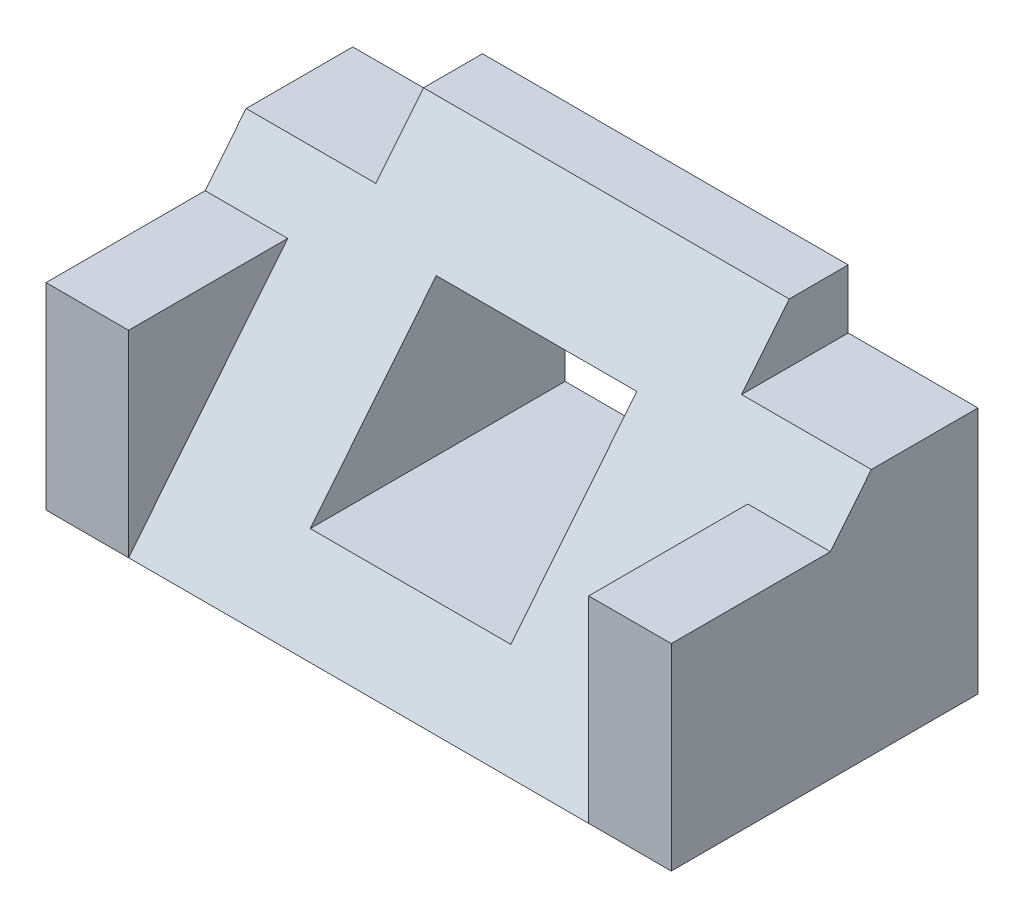
ISO-10303-21;
HEADER;
FILE_DESCRIPTION(('STEP AP214'),'2;1');
FILE_NAME('part.step','',(''),(''),'','','');
FILE_SCHEMA(('AUTOMOTIVE_DESIGN { 1 0 10303 214 1 1 1 1 }'));
ENDSEC;
DATA;
#1=APPLICATION_CONTEXT('core data for automotive mechanical design processes');
#2=APPLICATION_PROTOCOL_DEFINITION('international standard','automotive_design',2000,#1);
#3=PRODUCT_CONTEXT('',#1,'mechanical');
#4=PRODUCT('Part','Part','',(#3));
#5=PRODUCT_RELATED_PRODUCT_CATEGORY('part','',(#4));
#6=PRODUCT_DEFINITION_FORMATION('','',#4);
#7=PRODUCT_DEFINITION_CONTEXT('part definition',#1,'design');
#8=PRODUCT_DEFINITION('design','',#6,#7);
#9=PRODUCT_DEFINITION_SHAPE('','',#8);
#10=(LENGTH_UNIT() NAMED_UNIT(*) SI_UNIT(.MILLI.,.METRE.));
#11=(NAMED_UNIT(*) PLANE_ANGLE_UNIT() SI_UNIT($,.RADIAN.));
#12=(NAMED_UNIT(*) SI_UNIT($,.STERADIAN.) SOLID_ANGLE_UNIT());
#13=UNCERTAINTY_MEASURE_WITH_UNIT(LENGTH_MEASURE(1.E-05),#10,'distance_accuracy_value','');
#14=(GEOMETRIC_REPRESENTATION_CONTEXT(3) GLOBAL_UNCERTAINTY_ASSIGNED_CONTEXT((#13)) GLOBAL_UNIT_ASSIGNED_CONTEXT((#10,
#11,#12)) REPRESENTATION_CONTEXT('',''));
#15=CARTESIAN_POINT('',(0.,0.,0.));
#16=DIRECTION('',(0.,0.,1.));
#17=DIRECTION('',(1.,0.,0.));
#18=AXIS2_PLACEMENT_3D('',#15,#16,#17);
#19=CARTESIAN_POINT('',(26.5,-13.,-13.));
#20=DIRECTION('',(0.,0.,1.));
#21=DIRECTION('',(1.,0.,0.));
#22=AXIS2_PLACEMENT_3D('',#19,#20,#21);
#23=PLANE('',#22);
#24=DIRECTION('',(1.,0.,0.));
#25=VECTOR('',#24,1.);
#26=CARTESIAN_POINT('',(-8.5,-7.55441173857395,-13.));
#27=LINE('',#26,#25);
#28=CARTESIAN_POINT('',(-8.5,-7.55441173857395,-13.));
#29=VERTEX_POINT('',#28);
#30=CARTESIAN_POINT('',(8.5,-7.55441173857395,-13.));
#31=VERTEX_POINT('',#30);
#32=EDGE_CURVE('E170',#29,#31,#27,.T.);
#33=ORIENTED_EDGE('',*,*,#32,.T.);
#34=DIRECTION('',(0.,1.,0.));
#35=VECTOR('',#34,1.);
#36=CARTESIAN_POINT('',(8.5,-13.,-13.));
#37=LINE('',#36,#35);
#38=CARTESIAN_POINT('',(8.5,5.67058832488932,-13.));
#39=VERTEX_POINT('',#38);
#40=EDGE_CURVE('E182',#31,#39,#37,.T.);
#41=ORIENTED_EDGE('',*,*,#40,.T.);
#42=DIRECTION('',(-1.,0.,0.));
#43=VECTOR('',#42,1.);
#44=CARTESIAN_POINT('',(26.5,5.67058832488932,-13.));
#45=LINE('',#44,#43);
#46=CARTESIAN_POINT('',(-8.5,5.67058832488932,-13.));
#47=VERTEX_POINT('',#46);
#48=EDGE_CURVE('E180',#39,#47,#45,.T.);
#49=ORIENTED_EDGE('',*,*,#48,.T.);
#50=DIRECTION('',(0.,-1.,0.));
#51=VECTOR('',#50,1.);
#52=CARTESIAN_POINT('',(-8.5,-13.,-13.));
#53=LINE('',#52,#51);
#54=EDGE_CURVE('E161',#47,#29,#53,.T.);
#55=ORIENTED_EDGE('',*,*,#54,.T.);
#56=EDGE_LOOP('',(#33,#41,#49,#55));
#57=FACE_BOUND('',#56,.T.);
#58=DIRECTION('',(0.,-1.,0.));
#59=VECTOR('',#58,1.);
#60=CARTESIAN_POINT('',(-15.5,8.,-13.));
#61=LINE('',#60,#59);
#62=CARTESIAN_POINT('',(-15.5,13.,-13.));
#63=VERTEX_POINT('',#62);
#64=CARTESIAN_POINT('',(-15.5,8.,-13.));
#65=VERTEX_POINT('',#64);
#66=EDGE_CURVE('E222',#63,#65,#61,.T.);
#67=ORIENTED_EDGE('',*,*,#66,.F.);
#68=DIRECTION('',(-1.,0.,0.));
#69=VECTOR('',#68,1.);
#70=CARTESIAN_POINT('',(26.5,13.,-13.));
#71=LINE('',#70,#69);
#72=CARTESIAN_POINT('',(15.5,13.,-13.));
#73=VERTEX_POINT('',#72);
#74=EDGE_CURVE('E313',#73,#63,#71,.T.);
#75=ORIENTED_EDGE('',*,*,#74,.F.);
#76=DIRECTION('',(0.,-1.,0.));
#77=VECTOR('',#76,1.);
#78=CARTESIAN_POINT('',(15.5,8.,-13.));
#79=LINE('',#78,#77);
#80=CARTESIAN_POINT('',(15.5,8.,-13.));
#81=VERTEX_POINT('',#80);
#82=EDGE_CURVE('E239',#73,#81,#79,.T.);
#83=ORIENTED_EDGE('',*,*,#82,.T.);
#84=DIRECTION('',(1.,0.,0.));
#85=VECTOR('',#84,1.);
#86=CARTESIAN_POINT('',(26.5,8.,-13.));
#87=LINE('',#86,#85);
#88=CARTESIAN_POINT('',(26.5,8.,-13.));
#89=VERTEX_POINT('',#88);
#90=EDGE_CURVE('E243',#81,#89,#87,.T.);
#91=ORIENTED_EDGE('',*,*,#90,.T.);
#92=DIRECTION('',(0.,1.,0.));
#93=VECTOR('',#92,1.);
#94=CARTESIAN_POINT('',(26.5,-13.,-13.));
#95=LINE('',#94,#93);
#96=CARTESIAN_POINT('',(26.5,-13.,-13.));
#97=VERTEX_POINT('',#96);
#98=EDGE_CURVE('E285',#97,#89,#95,.T.);
#99=ORIENTED_EDGE('',*,*,#98,.F.);
#100=DIRECTION('',(-1.,0.,0.));
#101=VECTOR('',#100,1.);
#102=CARTESIAN_POINT('',(26.5,-13.,-13.));
#103=LINE('',#102,#101);
#104=CARTESIAN_POINT('',(-26.5,-13.,-13.));
#105=VERTEX_POINT('',#104);
#106=EDGE_CURVE('E296',#97,#105,#103,.T.);
#107=ORIENTED_EDGE('',*,*,#106,.T.);
#108=DIRECTION('',(0.,1.,0.));
#109=VECTOR('',#108,1.);
#110=CARTESIAN_POINT('',(-26.5,-13.,-13.));
#111=LINE('',#110,#109);
#112=CARTESIAN_POINT('',(-26.5,8.,-13.));
#113=VERTEX_POINT('',#112);
#114=EDGE_CURVE('E281',#105,#113,#111,.T.);
#115=ORIENTED_EDGE('',*,*,#114,.T.);
#116=DIRECTION('',(-1.,0.,0.));
#117=VECTOR('',#116,1.);
#118=CARTESIAN_POINT('',(-26.5,8.,-13.));
#119=LINE('',#118,#117);
#120=EDGE_CURVE('E219',#65,#113,#119,.T.);
#121=ORIENTED_EDGE('',*,*,#120,.F.);
#122=EDGE_LOOP('',(#67,#75,#83,#91,#99,#107,#115,#121));
#123=FACE_BOUND('',#122,.T.);
#124=ADVANCED_FACE('F39',(#57,#123),#23,.F.);
#125=CARTESIAN_POINT('',(26.5,13.,13.));
#126=DIRECTION('',(0.,-1.,0.));
#127=DIRECTION('',(0.,0.,-1.));
#128=AXIS2_PLACEMENT_3D('',#125,#126,#127);
#129=PLANE('',#128);
#130=DIRECTION('',(0.,0.,-1.));
#131=VECTOR('',#130,1.);
#132=CARTESIAN_POINT('',(-15.5,13.,13.));
#133=LINE('',#132,#131);
#134=CARTESIAN_POINT('',(-15.5,13.,-8.));
#135=VERTEX_POINT('',#134);
#136=EDGE_CURVE('E236',#135,#63,#133,.T.);
#137=ORIENTED_EDGE('',*,*,#136,.F.);
#138=DIRECTION('',(1.,0.,0.));
#139=VECTOR('',#138,1.);
#140=CARTESIAN_POINT('',(-19.5,13.,-8.));
#141=LINE('',#140,#139);
#142=CARTESIAN_POINT('',(15.5,13.,-8.));
#143=VERTEX_POINT('',#142);
#144=EDGE_CURVE('E278',#135,#143,#141,.T.);
#145=ORIENTED_EDGE('',*,*,#144,.T.);
#146=DIRECTION('',(0.,0.,-1.));
#147=VECTOR('',#146,1.);
#148=CARTESIAN_POINT('',(15.5,13.,13.));
#149=LINE('',#148,#147);
#150=EDGE_CURVE('E259',#143,#73,#149,.T.);
#151=ORIENTED_EDGE('',*,*,#150,.T.);
#152=ORIENTED_EDGE('',*,*,#74,.T.);
#153=EDGE_LOOP('',(#137,#145,#151,#152));
#154=FACE_BOUND('',#153,.T.);
#155=ADVANCED_FACE('F330',(#154),#129,.F.);
#156=CARTESIAN_POINT('',(26.5,-13.,13.));
#157=DIRECTION('',(0.,0.,-1.));
#158=DIRECTION('',(-1.,0.,0.));
#159=AXIS2_PLACEMENT_3D('',#156,#157,#158);
#160=PLANE('',#159);
#161=DIRECTION('',(0.,-1.,0.));
#162=VECTOR('',#161,1.);
#163=CARTESIAN_POINT('',(-19.5,-13.,13.));
#164=LINE('',#163,#162);
#165=CARTESIAN_POINT('',(-19.5,3.7,13.));
#166=VERTEX_POINT('',#165);
#167=CARTESIAN_POINT('',(-19.5,-13.,13.));
#168=VERTEX_POINT('',#167);
#169=EDGE_CURVE('E264',#166,#168,#164,.T.);
#170=ORIENTED_EDGE('',*,*,#169,.F.);
#171=DIRECTION('',(1.,0.,0.));
#172=VECTOR('',#171,1.);
#173=CARTESIAN_POINT('',(-26.5,3.7,13.));
#174=LINE('',#173,#172);
#175=CARTESIAN_POINT('',(-26.5,3.7,13.));
#176=VERTEX_POINT('',#175);
#177=EDGE_CURVE('E213',#176,#166,#174,.T.);
#178=ORIENTED_EDGE('',*,*,#177,.F.);
#179=DIRECTION('',(0.,-1.,0.));
#180=VECTOR('',#179,1.);
#181=CARTESIAN_POINT('',(-26.5,-13.,13.));
#182=LINE('',#181,#180);
#183=CARTESIAN_POINT('',(-26.5,-13.,13.));
#184=VERTEX_POINT('',#183);
#185=EDGE_CURVE('E300',#176,#184,#182,.T.);
#186=ORIENTED_EDGE('',*,*,#185,.T.);
#187=DIRECTION('',(-1.,0.,0.));
#188=VECTOR('',#187,1.);
#189=CARTESIAN_POINT('',(26.5,-13.,13.));
#190=LINE('',#189,#188);
#191=EDGE_CURVE('E308',#168,#184,#190,.T.);
#192=ORIENTED_EDGE('',*,*,#191,.F.);
#193=EDGE_LOOP('',(#170,#178,#186,#192));
#194=FACE_BOUND('',#193,.T.);
#195=ADVANCED_FACE('F355',(#194),#160,.F.);
#196=CARTESIAN_POINT('',(-26.5,0.,0.));
#197=DIRECTION('',(-1.,0.,0.));
#198=DIRECTION('',(0.,0.,1.));
#199=AXIS2_PLACEMENT_3D('',#196,#197,#198);
#200=PLANE('',#199);
#201=DIRECTION('',(0.,0.777941180203721,-0.628337107087621));
#202=VECTOR('',#201,1.);
#203=CARTESIAN_POINT('',(-26.5,3.7,-0.488461538461535));
#204=LINE('',#203,#202);
#205=CARTESIAN_POINT('',(-26.5,3.7,-0.488461538461535));
#206=VERTEX_POINT('',#205);
#207=CARTESIAN_POINT('',(-26.5,8.,-3.96153846153846));
#208=VERTEX_POINT('',#207);
#209=EDGE_CURVE('E195',#206,#208,#204,.T.);
#210=ORIENTED_EDGE('',*,*,#209,.T.);
#211=DIRECTION('',(0.,0.,1.));
#212=VECTOR('',#211,1.);
#213=CARTESIAN_POINT('',(-26.5,8.,-13.));
#214=LINE('',#213,#212);
#215=EDGE_CURVE('E225',#113,#208,#214,.T.);
#216=ORIENTED_EDGE('',*,*,#215,.F.);
#217=ORIENTED_EDGE('',*,*,#114,.F.);
#218=DIRECTION('',(0.,0.,-1.));
#219=VECTOR('',#218,1.);
#220=CARTESIAN_POINT('',(-26.5,-13.,13.));
#221=LINE('',#220,#219);
#222=EDGE_CURVE('E290',#184,#105,#221,.T.);
#223=ORIENTED_EDGE('',*,*,#222,.F.);
#224=ORIENTED_EDGE('',*,*,#185,.F.);
#225=DIRECTION('',(0.,0.,-1.));
#226=VECTOR('',#225,1.);
#227=CARTESIAN_POINT('',(-26.5,3.7,13.));
#228=LINE('',#227,#226);
#229=EDGE_CURVE('E191',#176,#206,#228,.T.);
#230=ORIENTED_EDGE('',*,*,#229,.T.);
#231=EDGE_LOOP('',(#210,#216,#217,#223,#224,#230));
#232=FACE_BOUND('',#231,.T.);
#233=ADVANCED_FACE('F346',(#232),#200,.T.);
#234=CARTESIAN_POINT('',(-19.5,-13.,13.));
#235=DIRECTION('',(0.,-0.628337107087621,-0.777941180203721));
#236=DIRECTION('',(0.,0.777941180203722,-0.628337107087621));
#237=AXIS2_PLACEMENT_3D('',#234,#235,#236);
#238=PLANE('',#237);
#239=DIRECTION('',(-1.,0.,0.));
#240=VECTOR('',#239,1.);
#241=CARTESIAN_POINT('',(-8.5,5.67058832488932,-2.08009057010291));
#242=LINE('',#241,#240);
#243=CARTESIAN_POINT('',(8.5,5.67058832488932,-2.08009057010291));
#244=VERTEX_POINT('',#243);
#245=CARTESIAN_POINT('',(-8.5,5.67058832488932,-2.08009057010291));
#246=VERTEX_POINT('',#245);
#247=EDGE_CURVE('E489',#244,#246,#242,.T.);
#248=ORIENTED_EDGE('',*,*,#247,.F.);
#249=DIRECTION('',(0.,0.777941180203721,-0.628337107087621));
#250=VECTOR('',#249,1.);
#251=CARTESIAN_POINT('',(8.5,-7.55441173857395,8.60164025038666));
#252=LINE('',#251,#250);
#253=CARTESIAN_POINT('',(8.5,-7.55441173857395,8.60164025038666));
#254=VERTEX_POINT('',#253);
#255=EDGE_CURVE('E61',#254,#244,#252,.T.);
#256=ORIENTED_EDGE('',*,*,#255,.F.);
#257=DIRECTION('',(1.,0.,0.));
#258=VECTOR('',#257,1.);
#259=CARTESIAN_POINT('',(-8.5,-7.55441173857395,8.60164025038666));
#260=LINE('',#259,#258);
#261=CARTESIAN_POINT('',(-8.5,-7.55441173857395,8.60164025038666));
#262=VERTEX_POINT('',#261);
#263=EDGE_CURVE('E176',#262,#254,#260,.T.);
#264=ORIENTED_EDGE('',*,*,#263,.F.);
#265=DIRECTION('',(0.,-0.777941180203721,0.628337107087621));
#266=VECTOR('',#265,1.);
#267=CARTESIAN_POINT('',(-8.5,-7.55441173857395,8.60164025038666));
#268=LINE('',#267,#266);
#269=EDGE_CURVE('E164',#246,#262,#268,.T.);
#270=ORIENTED_EDGE('',*,*,#269,.F.);
#271=EDGE_LOOP('',(#248,#256,#264,#270));
#272=FACE_BOUND('',#271,.T.);
#273=DIRECTION('',(0.,0.777941180203721,-0.628337107087621));
#274=VECTOR('',#273,1.);
#275=CARTESIAN_POINT('',(19.5,-13.,13.));
#276=LINE('',#275,#274);
#277=CARTESIAN_POINT('',(19.5,-13.,13.));
#278=VERTEX_POINT('',#277);
#279=CARTESIAN_POINT('',(19.5,3.7,-0.488461538461535));
#280=VERTEX_POINT('',#279);
#281=EDGE_CURVE('E268',#278,#280,#276,.T.);
#282=ORIENTED_EDGE('',*,*,#281,.T.);
#283=DIRECTION('',(1.,0.,0.));
#284=VECTOR('',#283,1.);
#285=CARTESIAN_POINT('',(-26.5,3.7,-0.488461538461535));
#286=LINE('',#285,#284);
#287=CARTESIAN_POINT('',(26.5,3.7,-0.488461538461535));
#288=VERTEX_POINT('',#287);
#289=EDGE_CURVE('E212',#280,#288,#286,.T.);
#290=ORIENTED_EDGE('',*,*,#289,.T.);
#291=DIRECTION('',(0.,0.777941180203721,-0.628337107087621));
#292=VECTOR('',#291,1.);
#293=CARTESIAN_POINT('',(26.5,3.7,-0.488461538461535));
#294=LINE('',#293,#292);
#295=CARTESIAN_POINT('',(26.5,8.,-3.96153846153846));
#296=VERTEX_POINT('',#295);
#297=EDGE_CURVE('E196',#288,#296,#294,.T.);
#298=ORIENTED_EDGE('',*,*,#297,.T.);
#299=DIRECTION('',(-1.,0.,0.));
#300=VECTOR('',#299,1.);
#301=CARTESIAN_POINT('',(-19.5,7.99999999999999,-3.96153846153846));
#302=LINE('',#301,#300);
#303=CARTESIAN_POINT('',(15.5,8.,-3.96153846153846));
#304=VERTEX_POINT('',#303);
#305=EDGE_CURVE('E252',#296,#304,#302,.T.);
#306=ORIENTED_EDGE('',*,*,#305,.T.);
#307=DIRECTION('',(0.,0.777941180203722,-0.628337107087621));
#308=VECTOR('',#307,1.);
#309=CARTESIAN_POINT('',(15.5,-13.,13.));
#310=LINE('',#309,#308);
#311=EDGE_CURVE('E317',#304,#143,#310,.T.);
#312=ORIENTED_EDGE('',*,*,#311,.T.);
#313=ORIENTED_EDGE('',*,*,#144,.F.);
#314=DIRECTION('',(0.,0.777941180203722,-0.628337107087621));
#315=VECTOR('',#314,1.);
#316=CARTESIAN_POINT('',(-15.5,-13.,13.));
#317=LINE('',#316,#315);
#318=CARTESIAN_POINT('',(-15.5,8.,-3.96153846153846));
#319=VERTEX_POINT('',#318);
#320=EDGE_CURVE('E47',#319,#135,#317,.T.);
#321=ORIENTED_EDGE('',*,*,#320,.F.);
#322=DIRECTION('',(1.,0.,0.));
#323=VECTOR('',#322,1.);
#324=CARTESIAN_POINT('',(-19.5,8.,-3.96153846153846));
#325=LINE('',#324,#323);
#326=EDGE_CURVE('E230',#208,#319,#325,.T.);
#327=ORIENTED_EDGE('',*,*,#326,.F.);
#328=ORIENTED_EDGE('',*,*,#209,.F.);
#329=CARTESIAN_POINT('',(-19.5,3.7,-0.488461538461535));
#330=VERTEX_POINT('',#329);
#331=EDGE_CURVE('E207',#206,#330,#286,.T.);
#332=ORIENTED_EDGE('',*,*,#331,.T.);
#333=DIRECTION('',(0.,0.777941180203721,-0.628337107087621));
#334=VECTOR('',#333,1.);
#335=CARTESIAN_POINT('',(-19.5,-13.,13.));
#336=LINE('',#335,#334);
#337=EDGE_CURVE('E267',#168,#330,#336,.T.);
#338=ORIENTED_EDGE('',*,*,#337,.F.);
#339=DIRECTION('',(1.,0.,0.));
#340=VECTOR('',#339,1.);
#341=CARTESIAN_POINT('',(-19.5,-13.,13.));
#342=LINE('',#341,#340);
#343=EDGE_CURVE('E272',#168,#278,#342,.T.);
#344=ORIENTED_EDGE('',*,*,#343,.T.);
#345=EDGE_LOOP('',(#282,#290,#298,#306,#312,#313,#321,#327,#328,#332,#338,#344));
#346=FACE_BOUND('',#345,.T.);
#347=ADVANCED_FACE('F333',(#272,#346),#238,.F.);
#348=CARTESIAN_POINT('',(-19.5,0.,0.));
#349=DIRECTION('',(-1.,0.,0.));
#350=DIRECTION('',(0.,0.,1.));
#351=AXIS2_PLACEMENT_3D('',#348,#349,#350);
#352=PLANE('',#351);
#353=ORIENTED_EDGE('',*,*,#337,.T.);
#354=DIRECTION('',(0.,0.,1.));
#355=VECTOR('',#354,1.);
#356=CARTESIAN_POINT('',(-19.5,3.7,0.));
#357=LINE('',#356,#355);
#358=EDGE_CURVE('E211',#330,#166,#357,.T.);
#359=ORIENTED_EDGE('',*,*,#358,.T.);
#360=ORIENTED_EDGE('',*,*,#169,.T.);
#361=EDGE_LOOP('',(#353,#359,#360));
#362=FACE_BOUND('',#361,.T.);
#363=ADVANCED_FACE('F361',(#362),#352,.F.);
#364=DIRECTION('',(0.,-1.,0.));
#365=VECTOR('',#364,1.);
#366=CARTESIAN_POINT('',(26.5,-13.,13.));
#367=LINE('',#366,#365);
#368=CARTESIAN_POINT('',(26.5,3.7,13.));
#369=VERTEX_POINT('',#368);
#370=CARTESIAN_POINT('',(26.5,-13.,13.));
#371=VERTEX_POINT('',#370);
#372=EDGE_CURVE('E289',#369,#371,#367,.T.);
#373=ORIENTED_EDGE('',*,*,#372,.F.);
#374=CARTESIAN_POINT('',(19.5,3.7,13.));
#375=VERTEX_POINT('',#374);
#376=EDGE_CURVE('E200',#375,#369,#174,.T.);
#377=ORIENTED_EDGE('',*,*,#376,.F.);
#378=DIRECTION('',(0.,-1.,0.));
#379=VECTOR('',#378,1.);
#380=CARTESIAN_POINT('',(19.5,-13.,13.));
#381=LINE('',#380,#379);
#382=EDGE_CURVE('E263',#375,#278,#381,.T.);
#383=ORIENTED_EDGE('',*,*,#382,.T.);
#384=EDGE_CURVE('E309',#371,#278,#190,.T.);
#385=ORIENTED_EDGE('',*,*,#384,.F.);
#386=EDGE_LOOP('',(#373,#377,#383,#385));
#387=FACE_BOUND('',#386,.T.);
#388=ADVANCED_FACE('F374',(#387),#160,.F.);
#389=CARTESIAN_POINT('',(26.5,-13.,13.));
#390=DIRECTION('',(0.,1.,0.));
#391=DIRECTION('',(0.,0.,1.));
#392=AXIS2_PLACEMENT_3D('',#389,#390,#391);
#393=PLANE('',#392);
#394=ORIENTED_EDGE('',*,*,#222,.T.);
#395=ORIENTED_EDGE('',*,*,#106,.F.);
#396=DIRECTION('',(0.,0.,-1.));
#397=VECTOR('',#396,1.);
#398=CARTESIAN_POINT('',(26.5,-13.,13.));
#399=LINE('',#398,#397);
#400=EDGE_CURVE('E293',#371,#97,#399,.T.);
#401=ORIENTED_EDGE('',*,*,#400,.F.);
#402=ORIENTED_EDGE('',*,*,#384,.T.);
#403=ORIENTED_EDGE('',*,*,#343,.F.);
#404=ORIENTED_EDGE('',*,*,#191,.T.);
#405=EDGE_LOOP('',(#394,#395,#401,#402,#403,#404));
#406=FACE_BOUND('',#405,.T.);
#407=ADVANCED_FACE('F370',(#406),#393,.F.);
#408=CARTESIAN_POINT('',(26.5,0.,0.));
#409=DIRECTION('',(-1.,0.,0.));
#410=DIRECTION('',(0.,0.,1.));
#411=AXIS2_PLACEMENT_3D('',#408,#409,#410);
#412=PLANE('',#411);
#413=DIRECTION('',(0.,0.,1.));
#414=VECTOR('',#413,1.);
#415=CARTESIAN_POINT('',(26.5,8.,-13.));
#416=LINE('',#415,#414);
#417=EDGE_CURVE('E248',#89,#296,#416,.T.);
#418=ORIENTED_EDGE('',*,*,#417,.T.);
#419=ORIENTED_EDGE('',*,*,#297,.F.);
#420=DIRECTION('',(0.,0.,-1.));
#421=VECTOR('',#420,1.);
#422=CARTESIAN_POINT('',(26.5,3.7,13.));
#423=LINE('',#422,#421);
#424=EDGE_CURVE('E186',#369,#288,#423,.T.);
#425=ORIENTED_EDGE('',*,*,#424,.F.);
#426=ORIENTED_EDGE('',*,*,#372,.T.);
#427=ORIENTED_EDGE('',*,*,#400,.T.);
#428=ORIENTED_EDGE('',*,*,#98,.T.);
#429=EDGE_LOOP('',(#418,#419,#425,#426,#427,#428));
#430=FACE_BOUND('',#429,.T.);
#431=ADVANCED_FACE('F382',(#430),#412,.F.);
#432=CARTESIAN_POINT('',(19.5,0.,0.));
#433=DIRECTION('',(-1.,0.,0.));
#434=DIRECTION('',(0.,0.,1.));
#435=AXIS2_PLACEMENT_3D('',#432,#433,#434);
#436=PLANE('',#435);
#437=DIRECTION('',(0.,0.,1.));
#438=VECTOR('',#437,1.);
#439=CARTESIAN_POINT('',(19.5,3.7,0.));
#440=LINE('',#439,#438);
#441=EDGE_CURVE('E11',#280,#375,#440,.T.);
#442=ORIENTED_EDGE('',*,*,#441,.F.);
#443=ORIENTED_EDGE('',*,*,#281,.F.);
#444=ORIENTED_EDGE('',*,*,#382,.F.);
#445=EDGE_LOOP('',(#442,#443,#444));
#446=FACE_BOUND('',#445,.T.);
#447=ADVANCED_FACE('F367',(#446),#436,.T.);
#448=CARTESIAN_POINT('',(15.5,8.,-13.));
#449=DIRECTION('',(-1.,0.,0.));
#450=DIRECTION('',(0.,-1.,0.));
#451=AXIS2_PLACEMENT_3D('',#448,#449,#450);
#452=PLANE('',#451);
#453=ORIENTED_EDGE('',*,*,#311,.F.);
#454=DIRECTION('',(0.,0.,1.));
#455=VECTOR('',#454,1.);
#456=CARTESIAN_POINT('',(15.5,8.,-13.));
#457=LINE('',#456,#455);
#458=EDGE_CURVE('E247',#81,#304,#457,.T.);
#459=ORIENTED_EDGE('',*,*,#458,.F.);
#460=ORIENTED_EDGE('',*,*,#82,.F.);
#461=ORIENTED_EDGE('',*,*,#150,.F.);
#462=EDGE_LOOP('',(#453,#459,#460,#461));
#463=FACE_BOUND('',#462,.T.);
#464=ADVANCED_FACE('F335',(#463),#452,.F.);
#465=CARTESIAN_POINT('',(26.5,8.,-13.));
#466=DIRECTION('',(0.,-1.,0.));
#467=DIRECTION('',(1.,0.,0.));
#468=AXIS2_PLACEMENT_3D('',#465,#466,#467);
#469=PLANE('',#468);
#470=ORIENTED_EDGE('',*,*,#305,.F.);
#471=ORIENTED_EDGE('',*,*,#417,.F.);
#472=ORIENTED_EDGE('',*,*,#90,.F.);
#473=ORIENTED_EDGE('',*,*,#458,.T.);
#474=EDGE_LOOP('',(#470,#471,#472,#473));
#475=FACE_BOUND('',#474,.T.);
#476=ADVANCED_FACE('F338',(#475),#469,.F.);
#477=CARTESIAN_POINT('',(-15.5,8.,-13.));
#478=DIRECTION('',(-1.,0.,0.));
#479=DIRECTION('',(0.,-1.,0.));
#480=AXIS2_PLACEMENT_3D('',#477,#478,#479);
#481=PLANE('',#480);
#482=ORIENTED_EDGE('',*,*,#136,.T.);
#483=ORIENTED_EDGE('',*,*,#66,.T.);
#484=DIRECTION('',(0.,0.,1.));
#485=VECTOR('',#484,1.);
#486=CARTESIAN_POINT('',(-15.5,8.,-13.));
#487=LINE('',#486,#485);
#488=EDGE_CURVE('E226',#65,#319,#487,.T.);
#489=ORIENTED_EDGE('',*,*,#488,.T.);
#490=ORIENTED_EDGE('',*,*,#320,.T.);
#491=EDGE_LOOP('',(#482,#483,#489,#490));
#492=FACE_BOUND('',#491,.T.);
#493=ADVANCED_FACE('F324',(#492),#481,.T.);
#494=CARTESIAN_POINT('',(-26.5,8.,-13.));
#495=DIRECTION('',(0.,1.,0.));
#496=DIRECTION('',(-1.,0.,0.));
#497=AXIS2_PLACEMENT_3D('',#494,#495,#496);
#498=PLANE('',#497);
#499=ORIENTED_EDGE('',*,*,#215,.T.);
#500=ORIENTED_EDGE('',*,*,#326,.T.);
#501=ORIENTED_EDGE('',*,*,#488,.F.);
#502=ORIENTED_EDGE('',*,*,#120,.T.);
#503=EDGE_LOOP('',(#499,#500,#501,#502));
#504=FACE_BOUND('',#503,.T.);
#505=ADVANCED_FACE('F342',(#504),#498,.T.);
#506=CARTESIAN_POINT('',(-26.5,3.7,13.));
#507=DIRECTION('',(0.,-1.,0.));
#508=DIRECTION('',(0.,0.,-1.));
#509=AXIS2_PLACEMENT_3D('',#506,#507,#508);
#510=PLANE('',#509);
#511=ORIENTED_EDGE('',*,*,#331,.F.);
#512=ORIENTED_EDGE('',*,*,#229,.F.);
#513=ORIENTED_EDGE('',*,*,#177,.T.);
#514=ORIENTED_EDGE('',*,*,#358,.F.);
#515=EDGE_LOOP('',(#511,#512,#513,#514));
#516=FACE_BOUND('',#515,.T.);
#517=ADVANCED_FACE('F352',(#516),#510,.F.);
#518=ORIENTED_EDGE('',*,*,#441,.T.);
#519=ORIENTED_EDGE('',*,*,#376,.T.);
#520=ORIENTED_EDGE('',*,*,#424,.T.);
#521=ORIENTED_EDGE('',*,*,#289,.F.);
#522=EDGE_LOOP('',(#518,#519,#520,#521));
#523=FACE_BOUND('',#522,.T.);
#524=ADVANCED_FACE('F384',(#523),#510,.F.);
#525=CARTESIAN_POINT('',(8.5,-7.55441173857395,-13.));
#526=DIRECTION('',(1.,0.,0.));
#527=DIRECTION('',(0.,0.,-1.));
#528=AXIS2_PLACEMENT_3D('',#525,#526,#527);
#529=PLANE('',#528);
#530=DIRECTION('',(0.,0.,1.));
#531=VECTOR('',#530,1.);
#532=CARTESIAN_POINT('',(8.5,-7.55441173857395,-13.));
#533=LINE('',#532,#531);
#534=EDGE_CURVE('E54',#31,#254,#533,.T.);
#535=ORIENTED_EDGE('',*,*,#534,.T.);
#536=ORIENTED_EDGE('',*,*,#255,.T.);
#537=DIRECTION('',(0.,0.,1.));
#538=VECTOR('',#537,1.);
#539=CARTESIAN_POINT('',(8.5,5.67058832488932,-23.6817308204896));
#540=LINE('',#539,#538);
#541=EDGE_CURVE('E175',#39,#244,#540,.T.);
#542=ORIENTED_EDGE('',*,*,#541,.F.);
#543=ORIENTED_EDGE('',*,*,#40,.F.);
#544=EDGE_LOOP('',(#535,#536,#542,#543));
#545=FACE_BOUND('',#544,.T.);
#546=ADVANCED_FACE('F386',(#545),#529,.F.);
#547=CARTESIAN_POINT('',(-8.5,-7.55441173857395,-13.));
#548=DIRECTION('',(-1.,0.,0.));
#549=DIRECTION('',(0.,0.,1.));
#550=AXIS2_PLACEMENT_3D('',#547,#548,#549);
#551=PLANE('',#550);
#552=DIRECTION('',(0.,0.,1.));
#553=VECTOR('',#552,1.);
#554=CARTESIAN_POINT('',(-8.5,5.67058832488932,-23.6817308204896));
#555=LINE('',#554,#553);
#556=EDGE_CURVE('E167',#47,#246,#555,.T.);
#557=ORIENTED_EDGE('',*,*,#556,.T.);
#558=ORIENTED_EDGE('',*,*,#269,.T.);
#559=DIRECTION('',(0.,0.,1.));
#560=VECTOR('',#559,1.);
#561=CARTESIAN_POINT('',(-8.5,-7.55441173857395,-13.));
#562=LINE('',#561,#560);
#563=EDGE_CURVE('E158',#29,#262,#562,.T.);
#564=ORIENTED_EDGE('',*,*,#563,.F.);
#565=ORIENTED_EDGE('',*,*,#54,.F.);
#566=EDGE_LOOP('',(#557,#558,#564,#565));
#567=FACE_BOUND('',#566,.T.);
#568=ADVANCED_FACE('F159',(#567),#551,.F.);
#569=CARTESIAN_POINT('',(-8.5,5.67058832488932,-23.6817308204896));
#570=DIRECTION('',(0.,1.,0.));
#571=DIRECTION('',(0.,0.,1.));
#572=AXIS2_PLACEMENT_3D('',#569,#570,#571);
#573=PLANE('',#572);
#574=ORIENTED_EDGE('',*,*,#541,.T.);
#575=ORIENTED_EDGE('',*,*,#247,.T.);
#576=ORIENTED_EDGE('',*,*,#556,.F.);
#577=ORIENTED_EDGE('',*,*,#48,.F.);
#578=EDGE_LOOP('',(#574,#575,#576,#577));
#579=FACE_BOUND('',#578,.T.);
#580=ADVANCED_FACE('F466',(#579),#573,.F.);
#581=CARTESIAN_POINT('',(-8.5,-7.55441173857395,-13.));
#582=DIRECTION('',(0.,-1.,0.));
#583=DIRECTION('',(0.,0.,-1.));
#584=AXIS2_PLACEMENT_3D('',#581,#582,#583);
#585=PLANE('',#584);
#586=ORIENTED_EDGE('',*,*,#263,.T.);
#587=ORIENTED_EDGE('',*,*,#534,.F.);
#588=ORIENTED_EDGE('',*,*,#32,.F.);
#589=ORIENTED_EDGE('',*,*,#563,.T.);
#590=EDGE_LOOP('',(#586,#587,#588,#589));
#591=FACE_BOUND('',#590,.T.);
#592=ADVANCED_FACE('F171',(#591),#585,.F.);
#593=CLOSED_SHELL('',(#124,#155,#195,#233,#347,#363,#388,#407,#431,#447,#464,#476,#493,#505,
#517,#524,#546,#568,#580,#592));
#594=MANIFOLD_SOLID_BREP('B2',#593);
#595=ADVANCED_BREP_SHAPE_REPRESENTATION('',(#18,#594),#14);
#596=SHAPE_DEFINITION_REPRESENTATION(#9,#595);
ENDSEC;
END-ISO-10303-21;
